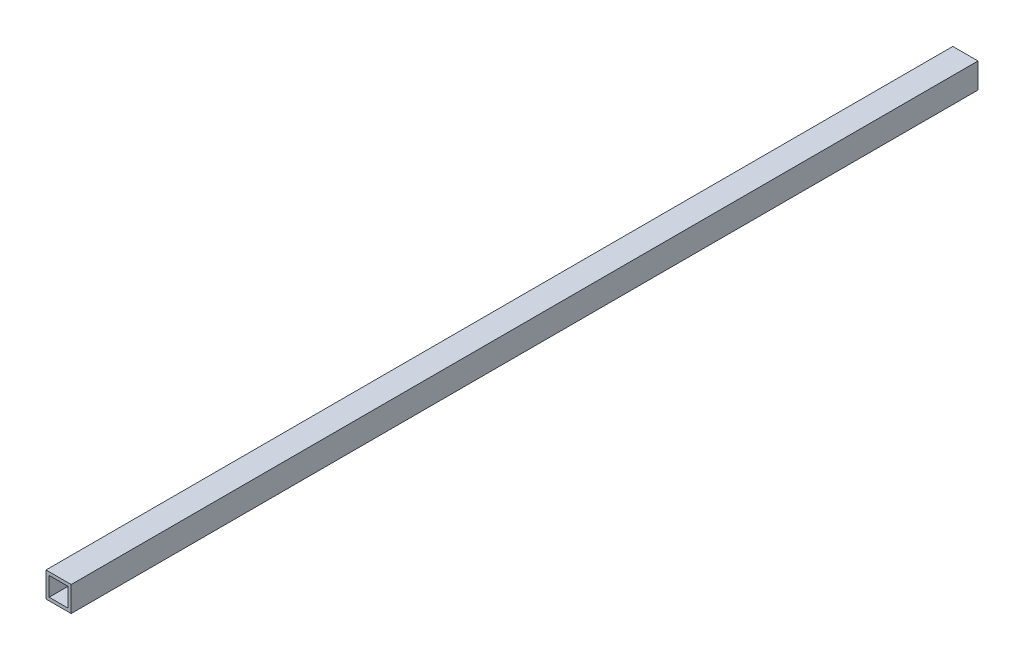
ISO-10303-21;
HEADER;
FILE_DESCRIPTION(('STEP AP214'),'2;1');
FILE_NAME('part.step','',(''),(''),'','','');
FILE_SCHEMA(('AUTOMOTIVE_DESIGN { 1 0 10303 214 1 1 1 1 }'));
ENDSEC;
DATA;
#1=APPLICATION_CONTEXT('core data for automotive mechanical design processes');
#2=APPLICATION_PROTOCOL_DEFINITION('international standard','automotive_design',2000,#1);
#3=PRODUCT_CONTEXT('',#1,'mechanical');
#4=PRODUCT('Part','Part','',(#3));
#5=PRODUCT_RELATED_PRODUCT_CATEGORY('part','',(#4));
#6=PRODUCT_DEFINITION_FORMATION('','',#4);
#7=PRODUCT_DEFINITION_CONTEXT('part definition',#1,'design');
#8=PRODUCT_DEFINITION('design','',#6,#7);
#9=PRODUCT_DEFINITION_SHAPE('','',#8);
#10=(LENGTH_UNIT() NAMED_UNIT(*) SI_UNIT(.MILLI.,.METRE.));
#11=(NAMED_UNIT(*) PLANE_ANGLE_UNIT() SI_UNIT($,.RADIAN.));
#12=(NAMED_UNIT(*) SI_UNIT($,.STERADIAN.) SOLID_ANGLE_UNIT());
#13=UNCERTAINTY_MEASURE_WITH_UNIT(LENGTH_MEASURE(1.E-05),#10,'distance_accuracy_value','');
#14=(GEOMETRIC_REPRESENTATION_CONTEXT(3) GLOBAL_UNCERTAINTY_ASSIGNED_CONTEXT((#13)) GLOBAL_UNIT_ASSIGNED_CONTEXT((#10,
#11,#12)) REPRESENTATION_CONTEXT('',''));
#15=CARTESIAN_POINT('',(0.,0.,0.));
#16=DIRECTION('',(0.,0.,1.));
#17=DIRECTION('',(1.,0.,0.));
#18=AXIS2_PLACEMENT_3D('',#15,#16,#17);
#19=CARTESIAN_POINT('',(0.,0.,1828.8));
#20=DIRECTION('',(0.,0.,-1.));
#21=DIRECTION('',(-1.,0.,0.));
#22=AXIS2_PLACEMENT_3D('',#19,#20,#21);
#23=PLANE('',#22);
#24=DIRECTION('',(0.,1.,0.));
#25=VECTOR('',#24,1.);
#26=CARTESIAN_POINT('',(25.4,-25.4,1828.8));
#27=LINE('',#26,#25);
#28=CARTESIAN_POINT('',(25.4,-25.4,1828.8));
#29=VERTEX_POINT('',#28);
#30=CARTESIAN_POINT('',(25.4,25.4,1828.8));
#31=VERTEX_POINT('',#30);
#32=EDGE_CURVE('E134',#29,#31,#27,.T.);
#33=ORIENTED_EDGE('',*,*,#32,.T.);
#34=DIRECTION('',(-1.,0.,0.));
#35=VECTOR('',#34,1.);
#36=CARTESIAN_POINT('',(-25.4,25.4,1828.8));
#37=LINE('',#36,#35);
#38=CARTESIAN_POINT('',(-25.4,25.4,1828.8));
#39=VERTEX_POINT('',#38);
#40=EDGE_CURVE('E137',#31,#39,#37,.T.);
#41=ORIENTED_EDGE('',*,*,#40,.T.);
#42=DIRECTION('',(0.,-1.,0.));
#43=VECTOR('',#42,1.);
#44=CARTESIAN_POINT('',(-25.4,-25.4,1828.8));
#45=LINE('',#44,#43);
#46=CARTESIAN_POINT('',(-25.4,-25.4,1828.8));
#47=VERTEX_POINT('',#46);
#48=EDGE_CURVE('E140',#39,#47,#45,.T.);
#49=ORIENTED_EDGE('',*,*,#48,.T.);
#50=DIRECTION('',(1.,0.,0.));
#51=VECTOR('',#50,1.);
#52=CARTESIAN_POINT('',(-25.4,-25.4,1828.8));
#53=LINE('',#52,#51);
#54=EDGE_CURVE('E142',#47,#29,#53,.T.);
#55=ORIENTED_EDGE('',*,*,#54,.T.);
#56=EDGE_LOOP('',(#33,#41,#49,#55));
#57=FACE_BOUND('',#56,.T.);
#58=DIRECTION('',(0.,1.,0.));
#59=VECTOR('',#58,1.);
#60=CARTESIAN_POINT('',(19.05,-19.05,1828.8));
#61=LINE('',#60,#59);
#62=CARTESIAN_POINT('',(19.05,-19.05,1828.8));
#63=VERTEX_POINT('',#62);
#64=CARTESIAN_POINT('',(19.05,19.05,1828.8));
#65=VERTEX_POINT('',#64);
#66=EDGE_CURVE('E98',#63,#65,#61,.T.);
#67=ORIENTED_EDGE('',*,*,#66,.F.);
#68=DIRECTION('',(1.,0.,0.));
#69=VECTOR('',#68,1.);
#70=CARTESIAN_POINT('',(-19.05,-19.05,1828.8));
#71=LINE('',#70,#69);
#72=CARTESIAN_POINT('',(-19.05,-19.05,1828.8));
#73=VERTEX_POINT('',#72);
#74=EDGE_CURVE('E120',#73,#63,#71,.T.);
#75=ORIENTED_EDGE('',*,*,#74,.F.);
#76=DIRECTION('',(0.,-1.,0.));
#77=VECTOR('',#76,1.);
#78=CARTESIAN_POINT('',(-19.05,-19.05,1828.8));
#79=LINE('',#78,#77);
#80=CARTESIAN_POINT('',(-19.05,19.05,1828.8));
#81=VERTEX_POINT('',#80);
#82=EDGE_CURVE('E118',#81,#73,#79,.T.);
#83=ORIENTED_EDGE('',*,*,#82,.F.);
#84=DIRECTION('',(-1.,0.,0.));
#85=VECTOR('',#84,1.);
#86=CARTESIAN_POINT('',(-19.05,19.05,1828.8));
#87=LINE('',#86,#85);
#88=EDGE_CURVE('E106',#65,#81,#87,.T.);
#89=ORIENTED_EDGE('',*,*,#88,.F.);
#90=EDGE_LOOP('',(#67,#75,#83,#89));
#91=FACE_BOUND('',#90,.T.);
#92=ADVANCED_FACE('F33',(#57,#91),#23,.F.);
#93=CARTESIAN_POINT('',(0.,0.,0.));
#94=DIRECTION('',(0.,0.,-1.));
#95=DIRECTION('',(-1.,0.,0.));
#96=AXIS2_PLACEMENT_3D('',#93,#94,#95);
#97=PLANE('',#96);
#98=DIRECTION('',(0.,1.,0.));
#99=VECTOR('',#98,1.);
#100=CARTESIAN_POINT('',(25.4,-25.4,0.));
#101=LINE('',#100,#99);
#102=CARTESIAN_POINT('',(25.4,-25.4,0.));
#103=VERTEX_POINT('',#102);
#104=CARTESIAN_POINT('',(25.4,25.4,0.));
#105=VERTEX_POINT('',#104);
#106=EDGE_CURVE('E114',#103,#105,#101,.T.);
#107=ORIENTED_EDGE('',*,*,#106,.F.);
#108=DIRECTION('',(1.,0.,0.));
#109=VECTOR('',#108,1.);
#110=CARTESIAN_POINT('',(-25.4,-25.4,0.));
#111=LINE('',#110,#109);
#112=CARTESIAN_POINT('',(-25.4,-25.4,0.));
#113=VERTEX_POINT('',#112);
#114=EDGE_CURVE('E138',#113,#103,#111,.T.);
#115=ORIENTED_EDGE('',*,*,#114,.F.);
#116=DIRECTION('',(0.,-1.,0.));
#117=VECTOR('',#116,1.);
#118=CARTESIAN_POINT('',(-25.4,-25.4,0.));
#119=LINE('',#118,#117);
#120=CARTESIAN_POINT('',(-25.4,25.4,0.));
#121=VERTEX_POINT('',#120);
#122=EDGE_CURVE('E149',#121,#113,#119,.T.);
#123=ORIENTED_EDGE('',*,*,#122,.F.);
#124=DIRECTION('',(-1.,0.,0.));
#125=VECTOR('',#124,1.);
#126=CARTESIAN_POINT('',(-25.4,25.4,0.));
#127=LINE('',#126,#125);
#128=EDGE_CURVE('E147',#105,#121,#127,.T.);
#129=ORIENTED_EDGE('',*,*,#128,.F.);
#130=EDGE_LOOP('',(#107,#115,#123,#129));
#131=FACE_BOUND('',#130,.T.);
#132=DIRECTION('',(1.,0.,0.));
#133=VECTOR('',#132,1.);
#134=CARTESIAN_POINT('',(-19.05,-19.05,0.));
#135=LINE('',#134,#133);
#136=CARTESIAN_POINT('',(-19.05,-19.05,0.));
#137=VERTEX_POINT('',#136);
#138=CARTESIAN_POINT('',(19.05,-19.05,0.));
#139=VERTEX_POINT('',#138);
#140=EDGE_CURVE('E107',#137,#139,#135,.T.);
#141=ORIENTED_EDGE('',*,*,#140,.T.);
#142=DIRECTION('',(0.,1.,0.));
#143=VECTOR('',#142,1.);
#144=CARTESIAN_POINT('',(19.05,-19.05,0.));
#145=LINE('',#144,#143);
#146=CARTESIAN_POINT('',(19.05,19.05,0.));
#147=VERTEX_POINT('',#146);
#148=EDGE_CURVE('E56',#139,#147,#145,.T.);
#149=ORIENTED_EDGE('',*,*,#148,.T.);
#150=DIRECTION('',(-1.,0.,0.));
#151=VECTOR('',#150,1.);
#152=CARTESIAN_POINT('',(-19.05,19.05,0.));
#153=LINE('',#152,#151);
#154=CARTESIAN_POINT('',(-19.05,19.05,0.));
#155=VERTEX_POINT('',#154);
#156=EDGE_CURVE('E113',#147,#155,#153,.T.);
#157=ORIENTED_EDGE('',*,*,#156,.T.);
#158=DIRECTION('',(0.,-1.,0.));
#159=VECTOR('',#158,1.);
#160=CARTESIAN_POINT('',(-19.05,-19.05,0.));
#161=LINE('',#160,#159);
#162=EDGE_CURVE('E126',#155,#137,#161,.T.);
#163=ORIENTED_EDGE('',*,*,#162,.T.);
#164=EDGE_LOOP('',(#141,#149,#157,#163));
#165=FACE_BOUND('',#164,.T.);
#166=ADVANCED_FACE('F167',(#131,#165),#97,.T.);
#167=CARTESIAN_POINT('',(25.4,-25.4,1828.8));
#168=DIRECTION('',(-1.,0.,0.));
#169=DIRECTION('',(0.,0.,1.));
#170=AXIS2_PLACEMENT_3D('',#167,#168,#169);
#171=PLANE('',#170);
#172=ORIENTED_EDGE('',*,*,#106,.T.);
#173=DIRECTION('',(0.,0.,-1.));
#174=VECTOR('',#173,1.);
#175=CARTESIAN_POINT('',(25.4,25.4,1828.8));
#176=LINE('',#175,#174);
#177=EDGE_CURVE('E11',#31,#105,#176,.T.);
#178=ORIENTED_EDGE('',*,*,#177,.F.);
#179=ORIENTED_EDGE('',*,*,#32,.F.);
#180=DIRECTION('',(0.,0.,-1.));
#181=VECTOR('',#180,1.);
#182=CARTESIAN_POINT('',(25.4,-25.4,1828.8));
#183=LINE('',#182,#181);
#184=EDGE_CURVE('E144',#29,#103,#183,.T.);
#185=ORIENTED_EDGE('',*,*,#184,.T.);
#186=EDGE_LOOP('',(#172,#178,#179,#185));
#187=FACE_BOUND('',#186,.T.);
#188=ADVANCED_FACE('F35',(#187),#171,.F.);
#189=CARTESIAN_POINT('',(-25.4,25.4,1828.8));
#190=DIRECTION('',(0.,-1.,0.));
#191=DIRECTION('',(0.,0.,-1.));
#192=AXIS2_PLACEMENT_3D('',#189,#190,#191);
#193=PLANE('',#192);
#194=ORIENTED_EDGE('',*,*,#128,.T.);
#195=DIRECTION('',(0.,0.,-1.));
#196=VECTOR('',#195,1.);
#197=CARTESIAN_POINT('',(-25.4,25.4,1828.8));
#198=LINE('',#197,#196);
#199=EDGE_CURVE('E41',#39,#121,#198,.T.);
#200=ORIENTED_EDGE('',*,*,#199,.F.);
#201=ORIENTED_EDGE('',*,*,#40,.F.);
#202=ORIENTED_EDGE('',*,*,#177,.T.);
#203=EDGE_LOOP('',(#194,#200,#201,#202));
#204=FACE_BOUND('',#203,.T.);
#205=ADVANCED_FACE('F177',(#204),#193,.F.);
#206=CARTESIAN_POINT('',(-25.4,-25.4,1828.8));
#207=DIRECTION('',(1.,0.,0.));
#208=DIRECTION('',(0.,0.,-1.));
#209=AXIS2_PLACEMENT_3D('',#206,#207,#208);
#210=PLANE('',#209);
#211=ORIENTED_EDGE('',*,*,#122,.T.);
#212=DIRECTION('',(0.,0.,-1.));
#213=VECTOR('',#212,1.);
#214=CARTESIAN_POINT('',(-25.4,-25.4,1828.8));
#215=LINE('',#214,#213);
#216=EDGE_CURVE('E154',#47,#113,#215,.T.);
#217=ORIENTED_EDGE('',*,*,#216,.F.);
#218=ORIENTED_EDGE('',*,*,#48,.F.);
#219=ORIENTED_EDGE('',*,*,#199,.T.);
#220=EDGE_LOOP('',(#211,#217,#218,#219));
#221=FACE_BOUND('',#220,.T.);
#222=ADVANCED_FACE('F161',(#221),#210,.F.);
#223=CARTESIAN_POINT('',(-25.4,-25.4,1828.8));
#224=DIRECTION('',(0.,1.,0.));
#225=DIRECTION('',(0.,0.,1.));
#226=AXIS2_PLACEMENT_3D('',#223,#224,#225);
#227=PLANE('',#226);
#228=ORIENTED_EDGE('',*,*,#114,.T.);
#229=ORIENTED_EDGE('',*,*,#184,.F.);
#230=ORIENTED_EDGE('',*,*,#54,.F.);
#231=ORIENTED_EDGE('',*,*,#216,.T.);
#232=EDGE_LOOP('',(#228,#229,#230,#231));
#233=FACE_BOUND('',#232,.T.);
#234=ADVANCED_FACE('F171',(#233),#227,.F.);
#235=CARTESIAN_POINT('',(19.05,-19.05,1828.8));
#236=DIRECTION('',(-1.,0.,0.));
#237=DIRECTION('',(0.,0.,1.));
#238=AXIS2_PLACEMENT_3D('',#235,#236,#237);
#239=PLANE('',#238);
#240=ORIENTED_EDGE('',*,*,#148,.F.);
#241=DIRECTION('',(0.,0.,-1.));
#242=VECTOR('',#241,1.);
#243=CARTESIAN_POINT('',(19.05,-19.05,1828.8));
#244=LINE('',#243,#242);
#245=EDGE_CURVE('E102',#63,#139,#244,.T.);
#246=ORIENTED_EDGE('',*,*,#245,.F.);
#247=ORIENTED_EDGE('',*,*,#66,.T.);
#248=DIRECTION('',(0.,0.,-1.));
#249=VECTOR('',#248,1.);
#250=CARTESIAN_POINT('',(19.05,19.05,1828.8));
#251=LINE('',#250,#249);
#252=EDGE_CURVE('E101',#65,#147,#251,.T.);
#253=ORIENTED_EDGE('',*,*,#252,.T.);
#254=EDGE_LOOP('',(#240,#246,#247,#253));
#255=FACE_BOUND('',#254,.T.);
#256=ADVANCED_FACE('F100',(#255),#239,.T.);
#257=CARTESIAN_POINT('',(-19.05,19.05,1828.8));
#258=DIRECTION('',(0.,-1.,0.));
#259=DIRECTION('',(0.,0.,-1.));
#260=AXIS2_PLACEMENT_3D('',#257,#258,#259);
#261=PLANE('',#260);
#262=ORIENTED_EDGE('',*,*,#156,.F.);
#263=ORIENTED_EDGE('',*,*,#252,.F.);
#264=ORIENTED_EDGE('',*,*,#88,.T.);
#265=DIRECTION('',(0.,0.,-1.));
#266=VECTOR('',#265,1.);
#267=CARTESIAN_POINT('',(-19.05,19.05,1828.8));
#268=LINE('',#267,#266);
#269=EDGE_CURVE('E115',#81,#155,#268,.T.);
#270=ORIENTED_EDGE('',*,*,#269,.T.);
#271=EDGE_LOOP('',(#262,#263,#264,#270));
#272=FACE_BOUND('',#271,.T.);
#273=ADVANCED_FACE('F110',(#272),#261,.T.);
#274=CARTESIAN_POINT('',(-19.05,-19.05,1828.8));
#275=DIRECTION('',(1.,0.,0.));
#276=DIRECTION('',(0.,0.,-1.));
#277=AXIS2_PLACEMENT_3D('',#274,#275,#276);
#278=PLANE('',#277);
#279=ORIENTED_EDGE('',*,*,#162,.F.);
#280=ORIENTED_EDGE('',*,*,#269,.F.);
#281=ORIENTED_EDGE('',*,*,#82,.T.);
#282=DIRECTION('',(0.,0.,-1.));
#283=VECTOR('',#282,1.);
#284=CARTESIAN_POINT('',(-19.05,-19.05,1828.8));
#285=LINE('',#284,#283);
#286=EDGE_CURVE('E48',#73,#137,#285,.T.);
#287=ORIENTED_EDGE('',*,*,#286,.T.);
#288=EDGE_LOOP('',(#279,#280,#281,#287));
#289=FACE_BOUND('',#288,.T.);
#290=ADVANCED_FACE('F200',(#289),#278,.T.);
#291=CARTESIAN_POINT('',(-19.05,-19.05,1828.8));
#292=DIRECTION('',(0.,1.,0.));
#293=DIRECTION('',(0.,0.,1.));
#294=AXIS2_PLACEMENT_3D('',#291,#292,#293);
#295=PLANE('',#294);
#296=ORIENTED_EDGE('',*,*,#140,.F.);
#297=ORIENTED_EDGE('',*,*,#286,.F.);
#298=ORIENTED_EDGE('',*,*,#74,.T.);
#299=ORIENTED_EDGE('',*,*,#245,.T.);
#300=EDGE_LOOP('',(#296,#297,#298,#299));
#301=FACE_BOUND('',#300,.T.);
#302=ADVANCED_FACE('F204',(#301),#295,.T.);
#303=CLOSED_SHELL('',(#92,#166,#188,#205,#222,#234,#256,#273,#290,#302));
#304=MANIFOLD_SOLID_BREP('B2',#303);
#305=ADVANCED_BREP_SHAPE_REPRESENTATION('',(#18,#304),#14);
#306=SHAPE_DEFINITION_REPRESENTATION(#9,#305);
ENDSEC;
END-ISO-10303-21;
